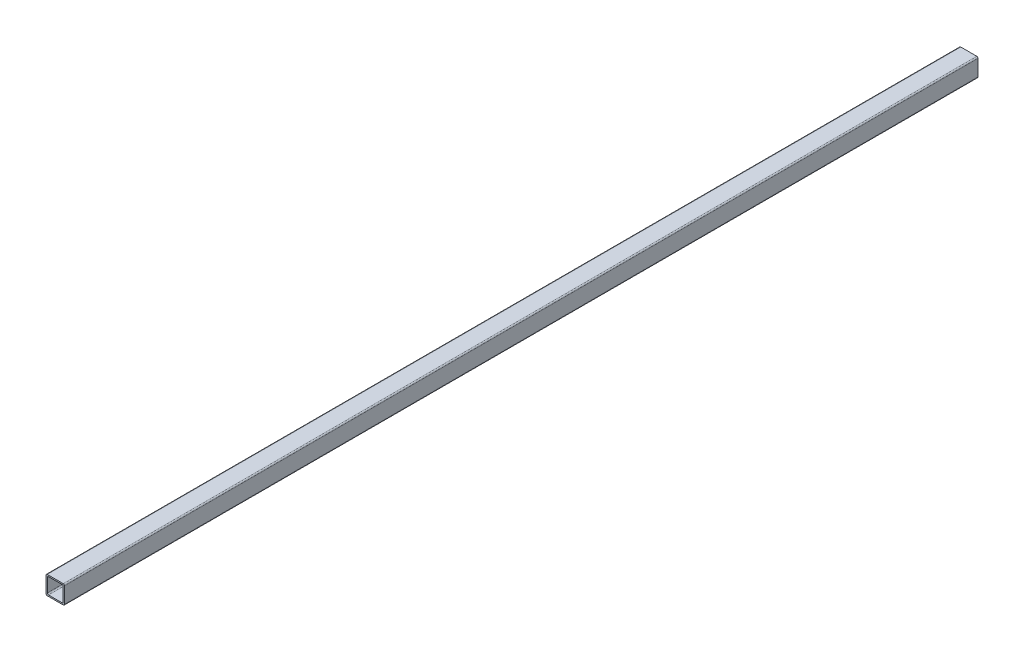
ISO-10303-21;
HEADER;
FILE_DESCRIPTION(('STEP AP214'),'2;1');
FILE_NAME('part.step','',(''),(''),'','','');
FILE_SCHEMA(('AUTOMOTIVE_DESIGN { 1 0 10303 214 1 1 1 1 }'));
ENDSEC;
DATA;
#1=APPLICATION_CONTEXT('core data for automotive mechanical design processes');
#2=APPLICATION_PROTOCOL_DEFINITION('international standard','automotive_design',2000,#1);
#3=PRODUCT_CONTEXT('',#1,'mechanical');
#4=PRODUCT('Part','Part','',(#3));
#5=PRODUCT_RELATED_PRODUCT_CATEGORY('part','',(#4));
#6=PRODUCT_DEFINITION_FORMATION('','',#4);
#7=PRODUCT_DEFINITION_CONTEXT('part definition',#1,'design');
#8=PRODUCT_DEFINITION('design','',#6,#7);
#9=PRODUCT_DEFINITION_SHAPE('','',#8);
#10=(LENGTH_UNIT() NAMED_UNIT(*) SI_UNIT(.MILLI.,.METRE.));
#11=(NAMED_UNIT(*) PLANE_ANGLE_UNIT() SI_UNIT($,.RADIAN.));
#12=(NAMED_UNIT(*) SI_UNIT($,.STERADIAN.) SOLID_ANGLE_UNIT());
#13=UNCERTAINTY_MEASURE_WITH_UNIT(LENGTH_MEASURE(1.E-05),#10,'distance_accuracy_value','');
#14=(GEOMETRIC_REPRESENTATION_CONTEXT(3) GLOBAL_UNCERTAINTY_ASSIGNED_CONTEXT((#13)) GLOBAL_UNIT_ASSIGNED_CONTEXT((#10,
#11,#12)) REPRESENTATION_CONTEXT('',''));
#15=CARTESIAN_POINT('',(0.,0.,0.));
#16=DIRECTION('',(0.,0.,1.));
#17=DIRECTION('',(1.,0.,0.));
#18=AXIS2_PLACEMENT_3D('',#15,#16,#17);
#19=CARTESIAN_POINT('',(2.54,-35.56,1880.));
#20=DIRECTION('',(0.,0.,1.));
#21=DIRECTION('',(1.,0.,0.));
#22=AXIS2_PLACEMENT_3D('',#19,#20,#21);
#23=PLANE('',#22);
#24=CARTESIAN_POINT('',(2.54,-35.56,1880.));
#25=DIRECTION('',(0.,0.,1.));
#26=DIRECTION('',(1.,0.,0.));
#27=AXIS2_PLACEMENT_3D('',#24,#25,#26);
#28=CIRCLE('',#27,2.54);
#29=CARTESIAN_POINT('',(0.,-35.56,1880.));
#30=VERTEX_POINT('',#29);
#31=CARTESIAN_POINT('',(2.54000000000002,-38.1,1880.));
#32=VERTEX_POINT('',#31);
#33=EDGE_CURVE('E212',#30,#32,#28,.T.);
#34=ORIENTED_EDGE('',*,*,#33,.T.);
#35=DIRECTION('',(1.,0.,0.));
#36=VECTOR('',#35,1.);
#37=CARTESIAN_POINT('',(2.54000000000002,-38.1,1880.));
#38=LINE('',#37,#36);
#39=CARTESIAN_POINT('',(35.56,-38.1,1880.));
#40=VERTEX_POINT('',#39);
#41=EDGE_CURVE('E215',#32,#40,#38,.T.);
#42=ORIENTED_EDGE('',*,*,#41,.T.);
#43=CARTESIAN_POINT('',(35.56,-35.56,1880.));
#44=DIRECTION('',(0.,0.,1.));
#45=DIRECTION('',(-1.,0.,0.));
#46=AXIS2_PLACEMENT_3D('',#43,#44,#45);
#47=CIRCLE('',#46,2.54);
#48=CARTESIAN_POINT('',(38.1,-35.56,1880.));
#49=VERTEX_POINT('',#48);
#50=EDGE_CURVE('E218',#40,#49,#47,.T.);
#51=ORIENTED_EDGE('',*,*,#50,.T.);
#52=DIRECTION('',(0.,1.,0.));
#53=VECTOR('',#52,1.);
#54=CARTESIAN_POINT('',(38.1,-2.54000000000002,1880.));
#55=LINE('',#54,#53);
#56=CARTESIAN_POINT('',(38.1,-2.54000000000002,1880.));
#57=VERTEX_POINT('',#56);
#58=EDGE_CURVE('E220',#49,#57,#55,.T.);
#59=ORIENTED_EDGE('',*,*,#58,.T.);
#60=CARTESIAN_POINT('',(35.56,-2.54,1880.));
#61=DIRECTION('',(0.,0.,1.));
#62=DIRECTION('',(1.,0.,0.));
#63=AXIS2_PLACEMENT_3D('',#60,#61,#62);
#64=CIRCLE('',#63,2.54);
#65=CARTESIAN_POINT('',(35.56,0.,1880.));
#66=VERTEX_POINT('',#65);
#67=EDGE_CURVE('E222',#57,#66,#64,.T.);
#68=ORIENTED_EDGE('',*,*,#67,.T.);
#69=DIRECTION('',(-1.,0.,0.));
#70=VECTOR('',#69,1.);
#71=CARTESIAN_POINT('',(2.54000000000002,0.,1880.));
#72=LINE('',#71,#70);
#73=CARTESIAN_POINT('',(2.54000000000002,0.,1880.));
#74=VERTEX_POINT('',#73);
#75=EDGE_CURVE('E224',#66,#74,#72,.T.);
#76=ORIENTED_EDGE('',*,*,#75,.T.);
#77=CARTESIAN_POINT('',(2.54,-2.54,1880.));
#78=DIRECTION('',(0.,0.,1.));
#79=DIRECTION('',(-1.,0.,0.));
#80=AXIS2_PLACEMENT_3D('',#77,#78,#79);
#81=CIRCLE('',#80,2.54);
#82=CARTESIAN_POINT('',(0.,-2.54000000000002,1880.));
#83=VERTEX_POINT('',#82);
#84=EDGE_CURVE('E226',#74,#83,#81,.T.);
#85=ORIENTED_EDGE('',*,*,#84,.T.);
#86=DIRECTION('',(0.,-1.,0.));
#87=VECTOR('',#86,1.);
#88=CARTESIAN_POINT('',(0.,-2.54000000000002,1880.));
#89=LINE('',#88,#87);
#90=EDGE_CURVE('E228',#83,#30,#89,.T.);
#91=ORIENTED_EDGE('',*,*,#90,.T.);
#92=EDGE_LOOP('',(#34,#42,#51,#59,#68,#76,#85,#91));
#93=FACE_BOUND('',#92,.T.);
#94=DIRECTION('',(1.,0.,0.));
#95=VECTOR('',#94,1.);
#96=CARTESIAN_POINT('',(5.30860000000002,-35.3314,1880.));
#97=LINE('',#96,#95);
#98=CARTESIAN_POINT('',(5.30860000000002,-35.3314,1880.));
#99=VERTEX_POINT('',#98);
#100=CARTESIAN_POINT('',(32.7914,-35.3314,1880.));
#101=VERTEX_POINT('',#100);
#102=EDGE_CURVE('E155',#99,#101,#97,.T.);
#103=ORIENTED_EDGE('',*,*,#102,.F.);
#104=CARTESIAN_POINT('',(5.3086,-32.7914,1880.));
#105=DIRECTION('',(0.,0.,1.));
#106=DIRECTION('',(1.,0.,0.));
#107=AXIS2_PLACEMENT_3D('',#104,#105,#106);
#108=CIRCLE('',#107,2.54);
#109=CARTESIAN_POINT('',(2.7686,-32.7914,1880.));
#110=VERTEX_POINT('',#109);
#111=EDGE_CURVE('E147',#110,#99,#108,.T.);
#112=ORIENTED_EDGE('',*,*,#111,.F.);
#113=DIRECTION('',(0.,-1.,0.));
#114=VECTOR('',#113,1.);
#115=CARTESIAN_POINT('',(2.7686,-5.30860000000002,1880.));
#116=LINE('',#115,#114);
#117=CARTESIAN_POINT('',(2.7686,-5.30860000000002,1880.));
#118=VERTEX_POINT('',#117);
#119=EDGE_CURVE('E180',#118,#110,#116,.T.);
#120=ORIENTED_EDGE('',*,*,#119,.F.);
#121=CARTESIAN_POINT('',(5.3086,-5.3086,1880.));
#122=DIRECTION('',(0.,0.,1.));
#123=DIRECTION('',(1.,0.,0.));
#124=AXIS2_PLACEMENT_3D('',#121,#122,#123);
#125=CIRCLE('',#124,2.54);
#126=CARTESIAN_POINT('',(5.30860000000002,-2.7686,1880.));
#127=VERTEX_POINT('',#126);
#128=EDGE_CURVE('E178',#127,#118,#125,.T.);
#129=ORIENTED_EDGE('',*,*,#128,.F.);
#130=DIRECTION('',(-1.,0.,0.));
#131=VECTOR('',#130,1.);
#132=CARTESIAN_POINT('',(5.30860000000002,-2.7686,1880.));
#133=LINE('',#132,#131);
#134=CARTESIAN_POINT('',(32.7914,-2.7686,1880.));
#135=VERTEX_POINT('',#134);
#136=EDGE_CURVE('E176',#135,#127,#133,.T.);
#137=ORIENTED_EDGE('',*,*,#136,.F.);
#138=CARTESIAN_POINT('',(32.7914,-5.3086,1880.));
#139=DIRECTION('',(0.,0.,1.));
#140=DIRECTION('',(1.,0.,0.));
#141=AXIS2_PLACEMENT_3D('',#138,#139,#140);
#142=CIRCLE('',#141,2.54);
#143=CARTESIAN_POINT('',(35.3314,-5.30860000000002,1880.));
#144=VERTEX_POINT('',#143);
#145=EDGE_CURVE('E174',#144,#135,#142,.T.);
#146=ORIENTED_EDGE('',*,*,#145,.F.);
#147=DIRECTION('',(0.,1.,0.));
#148=VECTOR('',#147,1.);
#149=CARTESIAN_POINT('',(35.3314,-5.30860000000002,1880.));
#150=LINE('',#149,#148);
#151=CARTESIAN_POINT('',(35.3314,-32.7914,1880.));
#152=VERTEX_POINT('',#151);
#153=EDGE_CURVE('E170',#152,#144,#150,.T.);
#154=ORIENTED_EDGE('',*,*,#153,.F.);
#155=CARTESIAN_POINT('',(32.7914,-32.7914,1880.));
#156=DIRECTION('',(0.,0.,1.));
#157=DIRECTION('',(1.,0.,0.));
#158=AXIS2_PLACEMENT_3D('',#155,#156,#157);
#159=CIRCLE('',#158,2.54);
#160=EDGE_CURVE('E168',#101,#152,#159,.T.);
#161=ORIENTED_EDGE('',*,*,#160,.F.);
#162=EDGE_LOOP('',(#103,#112,#120,#129,#137,#146,#154,#161));
#163=FACE_BOUND('',#162,.T.);
#164=ADVANCED_FACE('F34',(#93,#163),#23,.T.);
#165=CARTESIAN_POINT('',(2.54,-35.56,0.));
#166=DIRECTION('',(0.,0.,1.));
#167=DIRECTION('',(1.,0.,0.));
#168=AXIS2_PLACEMENT_3D('',#165,#166,#167);
#169=PLANE('',#168);
#170=CARTESIAN_POINT('',(2.54,-35.56,0.));
#171=DIRECTION('',(0.,0.,1.));
#172=DIRECTION('',(1.,0.,0.));
#173=AXIS2_PLACEMENT_3D('',#170,#171,#172);
#174=CIRCLE('',#173,2.54);
#175=CARTESIAN_POINT('',(0.,-35.56,0.));
#176=VERTEX_POINT('',#175);
#177=CARTESIAN_POINT('',(2.54000000000002,-38.1,0.));
#178=VERTEX_POINT('',#177);
#179=EDGE_CURVE('E163',#176,#178,#174,.T.);
#180=ORIENTED_EDGE('',*,*,#179,.F.);
#181=DIRECTION('',(0.,-1.,0.));
#182=VECTOR('',#181,1.);
#183=CARTESIAN_POINT('',(0.,-2.54000000000002,0.));
#184=LINE('',#183,#182);
#185=CARTESIAN_POINT('',(0.,-2.54000000000002,0.));
#186=VERTEX_POINT('',#185);
#187=EDGE_CURVE('E216',#186,#176,#184,.T.);
#188=ORIENTED_EDGE('',*,*,#187,.F.);
#189=CARTESIAN_POINT('',(2.54,-2.54,0.));
#190=DIRECTION('',(0.,0.,1.));
#191=DIRECTION('',(-1.,0.,0.));
#192=AXIS2_PLACEMENT_3D('',#189,#190,#191);
#193=CIRCLE('',#192,2.54);
#194=CARTESIAN_POINT('',(2.54000000000002,0.,0.));
#195=VERTEX_POINT('',#194);
#196=EDGE_CURVE('E243',#195,#186,#193,.T.);
#197=ORIENTED_EDGE('',*,*,#196,.F.);
#198=DIRECTION('',(-1.,0.,0.));
#199=VECTOR('',#198,1.);
#200=CARTESIAN_POINT('',(2.54000000000002,0.,0.));
#201=LINE('',#200,#199);
#202=CARTESIAN_POINT('',(35.56,0.,0.));
#203=VERTEX_POINT('',#202);
#204=EDGE_CURVE('E241',#203,#195,#201,.T.);
#205=ORIENTED_EDGE('',*,*,#204,.F.);
#206=CARTESIAN_POINT('',(35.56,-2.54,0.));
#207=DIRECTION('',(0.,0.,1.));
#208=DIRECTION('',(1.,0.,0.));
#209=AXIS2_PLACEMENT_3D('',#206,#207,#208);
#210=CIRCLE('',#209,2.54);
#211=CARTESIAN_POINT('',(38.1,-2.54000000000002,0.));
#212=VERTEX_POINT('',#211);
#213=EDGE_CURVE('E239',#212,#203,#210,.T.);
#214=ORIENTED_EDGE('',*,*,#213,.F.);
#215=DIRECTION('',(0.,1.,0.));
#216=VECTOR('',#215,1.);
#217=CARTESIAN_POINT('',(38.1,-2.54000000000002,0.));
#218=LINE('',#217,#216);
#219=CARTESIAN_POINT('',(38.1,-35.56,0.));
#220=VERTEX_POINT('',#219);
#221=EDGE_CURVE('E237',#220,#212,#218,.T.);
#222=ORIENTED_EDGE('',*,*,#221,.F.);
#223=CARTESIAN_POINT('',(35.56,-35.56,0.));
#224=DIRECTION('',(0.,0.,1.));
#225=DIRECTION('',(-1.,0.,0.));
#226=AXIS2_PLACEMENT_3D('',#223,#224,#225);
#227=CIRCLE('',#226,2.54);
#228=CARTESIAN_POINT('',(35.56,-38.1,0.));
#229=VERTEX_POINT('',#228);
#230=EDGE_CURVE('E235',#229,#220,#227,.T.);
#231=ORIENTED_EDGE('',*,*,#230,.F.);
#232=DIRECTION('',(1.,0.,0.));
#233=VECTOR('',#232,1.);
#234=CARTESIAN_POINT('',(2.54000000000002,-38.1,0.));
#235=LINE('',#234,#233);
#236=EDGE_CURVE('E233',#178,#229,#235,.T.);
#237=ORIENTED_EDGE('',*,*,#236,.F.);
#238=EDGE_LOOP('',(#180,#188,#197,#205,#214,#222,#231,#237));
#239=FACE_BOUND('',#238,.T.);
#240=CARTESIAN_POINT('',(5.3086,-32.7914,0.));
#241=DIRECTION('',(0.,0.,1.));
#242=DIRECTION('',(1.,0.,0.));
#243=AXIS2_PLACEMENT_3D('',#240,#241,#242);
#244=CIRCLE('',#243,2.54);
#245=CARTESIAN_POINT('',(2.7686,-32.7914,0.));
#246=VERTEX_POINT('',#245);
#247=CARTESIAN_POINT('',(5.30860000000002,-35.3314,0.));
#248=VERTEX_POINT('',#247);
#249=EDGE_CURVE('E57',#246,#248,#244,.T.);
#250=ORIENTED_EDGE('',*,*,#249,.T.);
#251=DIRECTION('',(1.,0.,0.));
#252=VECTOR('',#251,1.);
#253=CARTESIAN_POINT('',(5.30860000000002,-35.3314,0.));
#254=LINE('',#253,#252);
#255=CARTESIAN_POINT('',(32.7914,-35.3314,0.));
#256=VERTEX_POINT('',#255);
#257=EDGE_CURVE('E162',#248,#256,#254,.T.);
#258=ORIENTED_EDGE('',*,*,#257,.T.);
#259=CARTESIAN_POINT('',(32.7914,-32.7914,0.));
#260=DIRECTION('',(0.,0.,1.));
#261=DIRECTION('',(1.,0.,0.));
#262=AXIS2_PLACEMENT_3D('',#259,#260,#261);
#263=CIRCLE('',#262,2.54);
#264=CARTESIAN_POINT('',(35.3314,-32.7914,0.));
#265=VERTEX_POINT('',#264);
#266=EDGE_CURVE('E184',#256,#265,#263,.T.);
#267=ORIENTED_EDGE('',*,*,#266,.T.);
#268=DIRECTION('',(0.,1.,0.));
#269=VECTOR('',#268,1.);
#270=CARTESIAN_POINT('',(35.3314,-5.30860000000002,0.));
#271=LINE('',#270,#269);
#272=CARTESIAN_POINT('',(35.3314,-5.30860000000002,0.));
#273=VERTEX_POINT('',#272);
#274=EDGE_CURVE('E187',#265,#273,#271,.T.);
#275=ORIENTED_EDGE('',*,*,#274,.T.);
#276=CARTESIAN_POINT('',(32.7914,-5.3086,0.));
#277=DIRECTION('',(0.,0.,1.));
#278=DIRECTION('',(1.,0.,0.));
#279=AXIS2_PLACEMENT_3D('',#276,#277,#278);
#280=CIRCLE('',#279,2.54);
#281=CARTESIAN_POINT('',(32.7914,-2.7686,0.));
#282=VERTEX_POINT('',#281);
#283=EDGE_CURVE('E190',#273,#282,#280,.T.);
#284=ORIENTED_EDGE('',*,*,#283,.T.);
#285=DIRECTION('',(-1.,0.,0.));
#286=VECTOR('',#285,1.);
#287=CARTESIAN_POINT('',(5.30860000000002,-2.7686,0.));
#288=LINE('',#287,#286);
#289=CARTESIAN_POINT('',(5.30860000000002,-2.7686,0.));
#290=VERTEX_POINT('',#289);
#291=EDGE_CURVE('E193',#282,#290,#288,.T.);
#292=ORIENTED_EDGE('',*,*,#291,.T.);
#293=CARTESIAN_POINT('',(5.3086,-5.3086,0.));
#294=DIRECTION('',(0.,0.,1.));
#295=DIRECTION('',(1.,0.,0.));
#296=AXIS2_PLACEMENT_3D('',#293,#294,#295);
#297=CIRCLE('',#296,2.54);
#298=CARTESIAN_POINT('',(2.7686,-5.30860000000002,0.));
#299=VERTEX_POINT('',#298);
#300=EDGE_CURVE('E196',#290,#299,#297,.T.);
#301=ORIENTED_EDGE('',*,*,#300,.T.);
#302=DIRECTION('',(0.,-1.,0.));
#303=VECTOR('',#302,1.);
#304=CARTESIAN_POINT('',(2.7686,-5.30860000000002,0.));
#305=LINE('',#304,#303);
#306=EDGE_CURVE('E156',#299,#246,#305,.T.);
#307=ORIENTED_EDGE('',*,*,#306,.T.);
#308=EDGE_LOOP('',(#250,#258,#267,#275,#284,#292,#301,#307));
#309=FACE_BOUND('',#308,.T.);
#310=ADVANCED_FACE('F273',(#239,#309),#169,.F.);
#311=CARTESIAN_POINT('',(2.54,-35.56,1880.));
#312=DIRECTION('',(0.,0.,-1.));
#313=DIRECTION('',(-1.,0.,0.));
#314=AXIS2_PLACEMENT_3D('',#311,#312,#313);
#315=CYLINDRICAL_SURFACE('',#314,2.54);
#316=ORIENTED_EDGE('',*,*,#179,.T.);
#317=DIRECTION('',(0.,0.,-1.));
#318=VECTOR('',#317,1.);
#319=CARTESIAN_POINT('',(2.54000000000002,-38.1,1880.));
#320=LINE('',#319,#318);
#321=EDGE_CURVE('E11',#32,#178,#320,.T.);
#322=ORIENTED_EDGE('',*,*,#321,.F.);
#323=ORIENTED_EDGE('',*,*,#33,.F.);
#324=DIRECTION('',(0.,0.,-1.));
#325=VECTOR('',#324,1.);
#326=CARTESIAN_POINT('',(0.,-35.56,1880.));
#327=LINE('',#326,#325);
#328=EDGE_CURVE('E230',#30,#176,#327,.T.);
#329=ORIENTED_EDGE('',*,*,#328,.T.);
#330=EDGE_LOOP('',(#316,#322,#323,#329));
#331=FACE_BOUND('',#330,.T.);
#332=ADVANCED_FACE('F36',(#331),#315,.T.);
#333=CARTESIAN_POINT('',(2.54000000000002,-38.1,1880.));
#334=DIRECTION('',(0.,1.,0.));
#335=DIRECTION('',(0.,0.,1.));
#336=AXIS2_PLACEMENT_3D('',#333,#334,#335);
#337=PLANE('',#336);
#338=ORIENTED_EDGE('',*,*,#236,.T.);
#339=DIRECTION('',(0.,0.,-1.));
#340=VECTOR('',#339,1.);
#341=CARTESIAN_POINT('',(35.56,-38.1,1880.));
#342=LINE('',#341,#340);
#343=EDGE_CURVE('E42',#40,#229,#342,.T.);
#344=ORIENTED_EDGE('',*,*,#343,.F.);
#345=ORIENTED_EDGE('',*,*,#41,.F.);
#346=ORIENTED_EDGE('',*,*,#321,.T.);
#347=EDGE_LOOP('',(#338,#344,#345,#346));
#348=FACE_BOUND('',#347,.T.);
#349=ADVANCED_FACE('F290',(#348),#337,.F.);
#350=CARTESIAN_POINT('',(35.56,-35.56,1880.));
#351=DIRECTION('',(0.,0.,-1.));
#352=DIRECTION('',(-1.,0.,0.));
#353=AXIS2_PLACEMENT_3D('',#350,#351,#352);
#354=CYLINDRICAL_SURFACE('',#353,2.54);
#355=ORIENTED_EDGE('',*,*,#230,.T.);
#356=DIRECTION('',(0.,0.,-1.));
#357=VECTOR('',#356,1.);
#358=CARTESIAN_POINT('',(38.1,-35.56,1880.));
#359=LINE('',#358,#357);
#360=EDGE_CURVE('E260',#49,#220,#359,.T.);
#361=ORIENTED_EDGE('',*,*,#360,.F.);
#362=ORIENTED_EDGE('',*,*,#50,.F.);
#363=ORIENTED_EDGE('',*,*,#343,.T.);
#364=EDGE_LOOP('',(#355,#361,#362,#363));
#365=FACE_BOUND('',#364,.T.);
#366=ADVANCED_FACE('F267',(#365),#354,.T.);
#367=CARTESIAN_POINT('',(38.1,-2.54000000000002,1880.));
#368=DIRECTION('',(-1.,0.,0.));
#369=DIRECTION('',(0.,-1.,0.));
#370=AXIS2_PLACEMENT_3D('',#367,#368,#369);
#371=PLANE('',#370);
#372=ORIENTED_EDGE('',*,*,#221,.T.);
#373=DIRECTION('',(0.,0.,-1.));
#374=VECTOR('',#373,1.);
#375=CARTESIAN_POINT('',(38.1,-2.54000000000002,1880.));
#376=LINE('',#375,#374);
#377=EDGE_CURVE('E257',#57,#212,#376,.T.);
#378=ORIENTED_EDGE('',*,*,#377,.F.);
#379=ORIENTED_EDGE('',*,*,#58,.F.);
#380=ORIENTED_EDGE('',*,*,#360,.T.);
#381=EDGE_LOOP('',(#372,#378,#379,#380));
#382=FACE_BOUND('',#381,.T.);
#383=ADVANCED_FACE('F279',(#382),#371,.F.);
#384=CARTESIAN_POINT('',(35.56,-2.54,1880.));
#385=DIRECTION('',(0.,0.,-1.));
#386=DIRECTION('',(-1.,0.,0.));
#387=AXIS2_PLACEMENT_3D('',#384,#385,#386);
#388=CYLINDRICAL_SURFACE('',#387,2.54);
#389=ORIENTED_EDGE('',*,*,#213,.T.);
#390=DIRECTION('',(0.,0.,-1.));
#391=VECTOR('',#390,1.);
#392=CARTESIAN_POINT('',(35.56,0.,1880.));
#393=LINE('',#392,#391);
#394=EDGE_CURVE('E254',#66,#203,#393,.T.);
#395=ORIENTED_EDGE('',*,*,#394,.F.);
#396=ORIENTED_EDGE('',*,*,#67,.F.);
#397=ORIENTED_EDGE('',*,*,#377,.T.);
#398=EDGE_LOOP('',(#389,#395,#396,#397));
#399=FACE_BOUND('',#398,.T.);
#400=ADVANCED_FACE('F283',(#399),#388,.T.);
#401=CARTESIAN_POINT('',(2.54000000000002,0.,1880.));
#402=DIRECTION('',(0.,-1.,0.));
#403=DIRECTION('',(0.,0.,-1.));
#404=AXIS2_PLACEMENT_3D('',#401,#402,#403);
#405=PLANE('',#404);
#406=ORIENTED_EDGE('',*,*,#204,.T.);
#407=DIRECTION('',(0.,0.,-1.));
#408=VECTOR('',#407,1.);
#409=CARTESIAN_POINT('',(2.54000000000002,0.,1880.));
#410=LINE('',#409,#408);
#411=EDGE_CURVE('E251',#74,#195,#410,.T.);
#412=ORIENTED_EDGE('',*,*,#411,.F.);
#413=ORIENTED_EDGE('',*,*,#75,.F.);
#414=ORIENTED_EDGE('',*,*,#394,.T.);
#415=EDGE_LOOP('',(#406,#412,#413,#414));
#416=FACE_BOUND('',#415,.T.);
#417=ADVANCED_FACE('F303',(#416),#405,.F.);
#418=CARTESIAN_POINT('',(2.54,-2.54,1880.));
#419=DIRECTION('',(0.,0.,-1.));
#420=DIRECTION('',(-1.,0.,0.));
#421=AXIS2_PLACEMENT_3D('',#418,#419,#420);
#422=CYLINDRICAL_SURFACE('',#421,2.54);
#423=ORIENTED_EDGE('',*,*,#196,.T.);
#424=DIRECTION('',(0.,0.,-1.));
#425=VECTOR('',#424,1.);
#426=CARTESIAN_POINT('',(0.,-2.54000000000002,1880.));
#427=LINE('',#426,#425);
#428=EDGE_CURVE('E248',#83,#186,#427,.T.);
#429=ORIENTED_EDGE('',*,*,#428,.F.);
#430=ORIENTED_EDGE('',*,*,#84,.F.);
#431=ORIENTED_EDGE('',*,*,#411,.T.);
#432=EDGE_LOOP('',(#423,#429,#430,#431));
#433=FACE_BOUND('',#432,.T.);
#434=ADVANCED_FACE('F301',(#433),#422,.T.);
#435=CARTESIAN_POINT('',(0.,-2.54000000000002,1880.));
#436=DIRECTION('',(1.,0.,0.));
#437=DIRECTION('',(0.,1.,0.));
#438=AXIS2_PLACEMENT_3D('',#435,#436,#437);
#439=PLANE('',#438);
#440=ORIENTED_EDGE('',*,*,#187,.T.);
#441=ORIENTED_EDGE('',*,*,#328,.F.);
#442=ORIENTED_EDGE('',*,*,#90,.F.);
#443=ORIENTED_EDGE('',*,*,#428,.T.);
#444=EDGE_LOOP('',(#440,#441,#442,#443));
#445=FACE_BOUND('',#444,.T.);
#446=ADVANCED_FACE('F296',(#445),#439,.F.);
#447=CARTESIAN_POINT('',(5.3086,-32.7914,1880.));
#448=DIRECTION('',(0.,0.,-1.));
#449=DIRECTION('',(-1.,0.,0.));
#450=AXIS2_PLACEMENT_3D('',#447,#448,#449);
#451=CYLINDRICAL_SURFACE('',#450,2.54);
#452=ORIENTED_EDGE('',*,*,#249,.F.);
#453=DIRECTION('',(0.,0.,-1.));
#454=VECTOR('',#453,1.);
#455=CARTESIAN_POINT('',(2.7686,-32.7914,1880.));
#456=LINE('',#455,#454);
#457=EDGE_CURVE('E151',#110,#246,#456,.T.);
#458=ORIENTED_EDGE('',*,*,#457,.F.);
#459=ORIENTED_EDGE('',*,*,#111,.T.);
#460=DIRECTION('',(0.,0.,-1.));
#461=VECTOR('',#460,1.);
#462=CARTESIAN_POINT('',(5.30860000000002,-35.3314,1880.));
#463=LINE('',#462,#461);
#464=EDGE_CURVE('E150',#99,#248,#463,.T.);
#465=ORIENTED_EDGE('',*,*,#464,.T.);
#466=EDGE_LOOP('',(#452,#458,#459,#465));
#467=FACE_BOUND('',#466,.T.);
#468=ADVANCED_FACE('F149',(#467),#451,.F.);
#469=CARTESIAN_POINT('',(5.30860000000002,-35.3314,1880.));
#470=DIRECTION('',(0.,1.,0.));
#471=DIRECTION('',(0.,0.,1.));
#472=AXIS2_PLACEMENT_3D('',#469,#470,#471);
#473=PLANE('',#472);
#474=ORIENTED_EDGE('',*,*,#257,.F.);
#475=ORIENTED_EDGE('',*,*,#464,.F.);
#476=ORIENTED_EDGE('',*,*,#102,.T.);
#477=DIRECTION('',(0.,0.,-1.));
#478=VECTOR('',#477,1.);
#479=CARTESIAN_POINT('',(32.7914,-35.3314,1880.));
#480=LINE('',#479,#478);
#481=EDGE_CURVE('E164',#101,#256,#480,.T.);
#482=ORIENTED_EDGE('',*,*,#481,.T.);
#483=EDGE_LOOP('',(#474,#475,#476,#482));
#484=FACE_BOUND('',#483,.T.);
#485=ADVANCED_FACE('F159',(#484),#473,.T.);
#486=CARTESIAN_POINT('',(32.7914,-32.7914,1880.));
#487=DIRECTION('',(0.,0.,-1.));
#488=DIRECTION('',(-1.,0.,0.));
#489=AXIS2_PLACEMENT_3D('',#486,#487,#488);
#490=CYLINDRICAL_SURFACE('',#489,2.54);
#491=ORIENTED_EDGE('',*,*,#266,.F.);
#492=ORIENTED_EDGE('',*,*,#481,.F.);
#493=ORIENTED_EDGE('',*,*,#160,.T.);
#494=DIRECTION('',(0.,0.,-1.));
#495=VECTOR('',#494,1.);
#496=CARTESIAN_POINT('',(35.3314,-32.7914,1880.));
#497=LINE('',#496,#495);
#498=EDGE_CURVE('E209',#152,#265,#497,.T.);
#499=ORIENTED_EDGE('',*,*,#498,.T.);
#500=EDGE_LOOP('',(#491,#492,#493,#499));
#501=FACE_BOUND('',#500,.T.);
#502=ADVANCED_FACE('F328',(#501),#490,.F.);
#503=CARTESIAN_POINT('',(35.3314,-5.30860000000002,1880.));
#504=DIRECTION('',(-1.,0.,0.));
#505=DIRECTION('',(0.,0.,1.));
#506=AXIS2_PLACEMENT_3D('',#503,#504,#505);
#507=PLANE('',#506);
#508=ORIENTED_EDGE('',*,*,#274,.F.);
#509=ORIENTED_EDGE('',*,*,#498,.F.);
#510=ORIENTED_EDGE('',*,*,#153,.T.);
#511=DIRECTION('',(0.,0.,-1.));
#512=VECTOR('',#511,1.);
#513=CARTESIAN_POINT('',(35.3314,-5.30860000000002,1880.));
#514=LINE('',#513,#512);
#515=EDGE_CURVE('E207',#144,#273,#514,.T.);
#516=ORIENTED_EDGE('',*,*,#515,.T.);
#517=EDGE_LOOP('',(#508,#509,#510,#516));
#518=FACE_BOUND('',#517,.T.);
#519=ADVANCED_FACE('F332',(#518),#507,.T.);
#520=CARTESIAN_POINT('',(32.7914,-5.3086,1880.));
#521=DIRECTION('',(0.,0.,-1.));
#522=DIRECTION('',(-1.,0.,0.));
#523=AXIS2_PLACEMENT_3D('',#520,#521,#522);
#524=CYLINDRICAL_SURFACE('',#523,2.54);
#525=ORIENTED_EDGE('',*,*,#283,.F.);
#526=ORIENTED_EDGE('',*,*,#515,.F.);
#527=ORIENTED_EDGE('',*,*,#145,.T.);
#528=DIRECTION('',(0.,0.,-1.));
#529=VECTOR('',#528,1.);
#530=CARTESIAN_POINT('',(32.7914,-2.7686,1880.));
#531=LINE('',#530,#529);
#532=EDGE_CURVE('E205',#135,#282,#531,.T.);
#533=ORIENTED_EDGE('',*,*,#532,.T.);
#534=EDGE_LOOP('',(#525,#526,#527,#533));
#535=FACE_BOUND('',#534,.T.);
#536=ADVANCED_FACE('F338',(#535),#524,.F.);
#537=CARTESIAN_POINT('',(5.30860000000002,-2.7686,1880.));
#538=DIRECTION('',(0.,-1.,0.));
#539=DIRECTION('',(0.,0.,-1.));
#540=AXIS2_PLACEMENT_3D('',#537,#538,#539);
#541=PLANE('',#540);
#542=ORIENTED_EDGE('',*,*,#291,.F.);
#543=ORIENTED_EDGE('',*,*,#532,.F.);
#544=ORIENTED_EDGE('',*,*,#136,.T.);
#545=DIRECTION('',(0.,0.,-1.));
#546=VECTOR('',#545,1.);
#547=CARTESIAN_POINT('',(5.30860000000002,-2.7686,1880.));
#548=LINE('',#547,#546);
#549=EDGE_CURVE('E203',#127,#290,#548,.T.);
#550=ORIENTED_EDGE('',*,*,#549,.T.);
#551=EDGE_LOOP('',(#542,#543,#544,#550));
#552=FACE_BOUND('',#551,.T.);
#553=ADVANCED_FACE('F342',(#552),#541,.T.);
#554=CARTESIAN_POINT('',(5.3086,-5.3086,1880.));
#555=DIRECTION('',(0.,0.,-1.));
#556=DIRECTION('',(-1.,0.,0.));
#557=AXIS2_PLACEMENT_3D('',#554,#555,#556);
#558=CYLINDRICAL_SURFACE('',#557,2.54);
#559=ORIENTED_EDGE('',*,*,#300,.F.);
#560=ORIENTED_EDGE('',*,*,#549,.F.);
#561=ORIENTED_EDGE('',*,*,#128,.T.);
#562=DIRECTION('',(0.,0.,-1.));
#563=VECTOR('',#562,1.);
#564=CARTESIAN_POINT('',(2.7686,-5.30860000000002,1880.));
#565=LINE('',#564,#563);
#566=EDGE_CURVE('E49',#118,#299,#565,.T.);
#567=ORIENTED_EDGE('',*,*,#566,.T.);
#568=EDGE_LOOP('',(#559,#560,#561,#567));
#569=FACE_BOUND('',#568,.T.);
#570=ADVANCED_FACE('F346',(#569),#558,.F.);
#571=CARTESIAN_POINT('',(2.7686,-5.30860000000002,1880.));
#572=DIRECTION('',(1.,0.,0.));
#573=DIRECTION('',(0.,0.,-1.));
#574=AXIS2_PLACEMENT_3D('',#571,#572,#573);
#575=PLANE('',#574);
#576=ORIENTED_EDGE('',*,*,#306,.F.);
#577=ORIENTED_EDGE('',*,*,#566,.F.);
#578=ORIENTED_EDGE('',*,*,#119,.T.);
#579=ORIENTED_EDGE('',*,*,#457,.T.);
#580=EDGE_LOOP('',(#576,#577,#578,#579));
#581=FACE_BOUND('',#580,.T.);
#582=ADVANCED_FACE('F350',(#581),#575,.T.);
#583=CLOSED_SHELL('',(#164,#310,#332,#349,#366,#383,#400,#417,#434,#446,#468,#485,#502,#519,
#536,#553,#570,#582));
#584=MANIFOLD_SOLID_BREP('B2',#583);
#585=ADVANCED_BREP_SHAPE_REPRESENTATION('',(#18,#584),#14);
#586=SHAPE_DEFINITION_REPRESENTATION(#9,#585);
ENDSEC;
END-ISO-10303-21;
